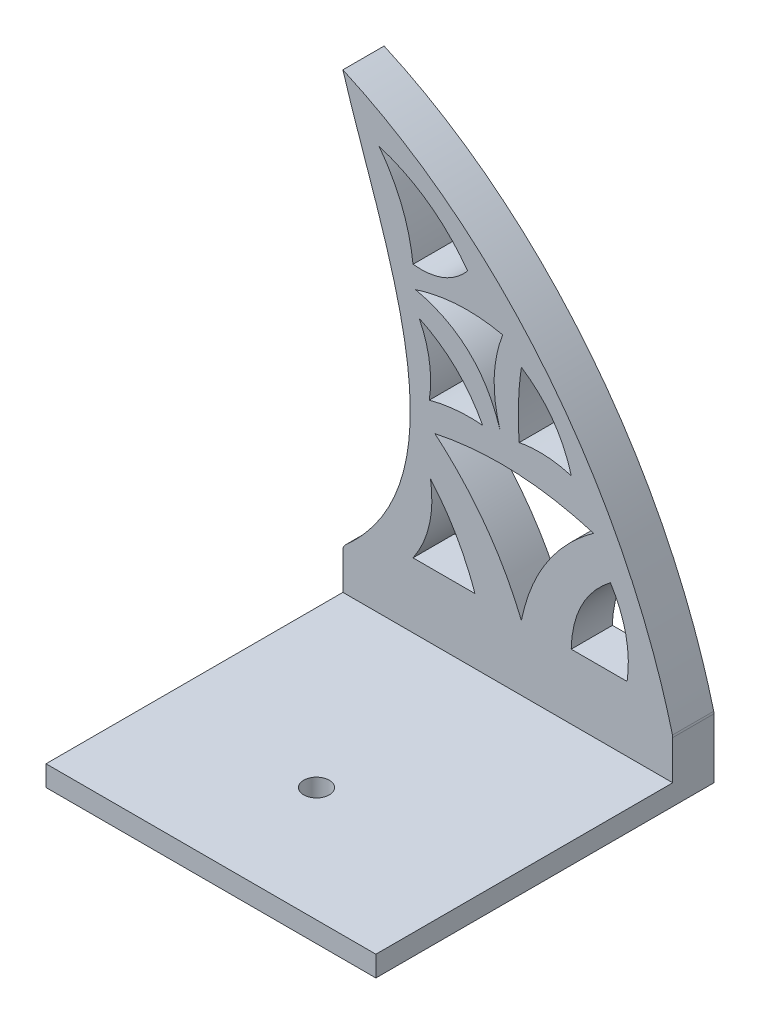
ISO-10303-21;
HEADER;
FILE_DESCRIPTION(('STEP AP214'),'2;1');
FILE_NAME('part.step','',(''),(''),'','','');
FILE_SCHEMA(('AUTOMOTIVE_DESIGN { 1 0 10303 214 1 1 1 1 }'));
ENDSEC;
DATA;
#1=APPLICATION_CONTEXT('core data for automotive mechanical design processes');
#2=APPLICATION_PROTOCOL_DEFINITION('international standard','automotive_design',2000,#1);
#3=PRODUCT_CONTEXT('',#1,'mechanical');
#4=PRODUCT('Part','Part','',(#3));
#5=PRODUCT_RELATED_PRODUCT_CATEGORY('part','',(#4));
#6=PRODUCT_DEFINITION_FORMATION('','',#4);
#7=PRODUCT_DEFINITION_CONTEXT('part definition',#1,'design');
#8=PRODUCT_DEFINITION('design','',#6,#7);
#9=PRODUCT_DEFINITION_SHAPE('','',#8);
#10=(LENGTH_UNIT() NAMED_UNIT(*) SI_UNIT(.MILLI.,.METRE.));
#11=(NAMED_UNIT(*) PLANE_ANGLE_UNIT() SI_UNIT($,.RADIAN.));
#12=(NAMED_UNIT(*) SI_UNIT($,.STERADIAN.) SOLID_ANGLE_UNIT());
#13=UNCERTAINTY_MEASURE_WITH_UNIT(LENGTH_MEASURE(1.E-05),#10,'distance_accuracy_value','');
#14=(GEOMETRIC_REPRESENTATION_CONTEXT(3) GLOBAL_UNCERTAINTY_ASSIGNED_CONTEXT((#13)) GLOBAL_UNIT_ASSIGNED_CONTEXT((#10,
#11,#12)) REPRESENTATION_CONTEXT('',''));
#15=CARTESIAN_POINT('',(0.,0.,0.));
#16=DIRECTION('',(0.,0.,1.));
#17=DIRECTION('',(1.,0.,0.));
#18=AXIS2_PLACEMENT_3D('',#15,#16,#17);
#19=CARTESIAN_POINT('',(0.,0.,12.7));
#20=DIRECTION('',(-1.,0.,0.));
#21=DIRECTION('',(0.,0.,1.));
#22=AXIS2_PLACEMENT_3D('',#19,#20,#21);
#23=PLANE('',#22);
#24=DIRECTION('',(0.,1.,0.));
#25=VECTOR('',#24,1.);
#26=CARTESIAN_POINT('',(0.,0.,0.));
#27=LINE('',#26,#25);
#28=CARTESIAN_POINT('',(0.,133.663922723156,0.));
#29=VERTEX_POINT('',#28);
#30=CARTESIAN_POINT('',(0.,151.251284081008,0.));
#31=VERTEX_POINT('',#30);
#32=EDGE_CURVE('E369',#29,#31,#27,.T.);
#33=ORIENTED_EDGE('',*,*,#32,.F.);
#34=DIRECTION('',(0.,0.,1.));
#35=VECTOR('',#34,1.);
#36=CARTESIAN_POINT('',(0.,133.663922723156,0.));
#37=LINE('',#36,#35);
#38=CARTESIAN_POINT('',(0.,133.663922723156,104.14));
#39=VERTEX_POINT('',#38);
#40=EDGE_CURVE('E73',#29,#39,#37,.T.);
#41=ORIENTED_EDGE('',*,*,#40,.T.);
#42=DIRECTION('',(0.,-1.,0.));
#43=VECTOR('',#42,1.);
#44=CARTESIAN_POINT('',(0.,133.663922723156,104.14));
#45=LINE('',#44,#43);
#46=CARTESIAN_POINT('',(0.,140.013922723156,104.14));
#47=VERTEX_POINT('',#46);
#48=EDGE_CURVE('E257',#47,#39,#45,.T.);
#49=ORIENTED_EDGE('',*,*,#48,.F.);
#50=DIRECTION('',(0.,0.,-1.));
#51=VECTOR('',#50,1.);
#52=CARTESIAN_POINT('',(0.,140.013922723156,104.14));
#53=LINE('',#52,#51);
#54=CARTESIAN_POINT('',(0.,140.013922723156,12.7));
#55=VERTEX_POINT('',#54);
#56=EDGE_CURVE('E252',#47,#55,#53,.T.);
#57=ORIENTED_EDGE('',*,*,#56,.T.);
#58=DIRECTION('',(0.,1.,0.));
#59=VECTOR('',#58,1.);
#60=CARTESIAN_POINT('',(0.,0.,12.7));
#61=LINE('',#60,#59);
#62=CARTESIAN_POINT('',(0.,151.251284081008,12.7));
#63=VERTEX_POINT('',#62);
#64=EDGE_CURVE('E368',#55,#63,#61,.T.);
#65=ORIENTED_EDGE('',*,*,#64,.T.);
#66=DIRECTION('',(0.,0.,-1.));
#67=VECTOR('',#66,1.);
#68=CARTESIAN_POINT('',(0.,151.251284081008,12.7));
#69=LINE('',#68,#67);
#70=EDGE_CURVE('E58',#63,#31,#69,.T.);
#71=ORIENTED_EDGE('',*,*,#70,.T.);
#72=EDGE_LOOP('',(#33,#41,#49,#57,#65,#71));
#73=FACE_BOUND('',#72,.T.);
#74=ADVANCED_FACE('F49',(#73),#23,.T.);
#75=CARTESIAN_POINT('',(101.6,0.,12.7));
#76=DIRECTION('',(-1.,0.,0.));
#77=DIRECTION('',(0.,0.,1.));
#78=AXIS2_PLACEMENT_3D('',#75,#76,#77);
#79=PLANE('',#78);
#80=DIRECTION('',(0.,0.,1.));
#81=VECTOR('',#80,1.);
#82=CARTESIAN_POINT('',(101.6,133.663922723156,0.));
#83=LINE('',#82,#81);
#84=CARTESIAN_POINT('',(101.6,133.663922723156,0.));
#85=VERTEX_POINT('',#84);
#86=CARTESIAN_POINT('',(101.6,133.663922723156,104.14));
#87=VERTEX_POINT('',#86);
#88=EDGE_CURVE('E281',#85,#87,#83,.T.);
#89=ORIENTED_EDGE('',*,*,#88,.F.);
#90=DIRECTION('',(0.,1.,0.));
#91=VECTOR('',#90,1.);
#92=CARTESIAN_POINT('',(101.6,0.,0.));
#93=LINE('',#92,#91);
#94=CARTESIAN_POINT('',(101.6,152.077820816032,0.));
#95=VERTEX_POINT('',#94);
#96=EDGE_CURVE('E372',#85,#95,#93,.T.);
#97=ORIENTED_EDGE('',*,*,#96,.T.);
#98=DIRECTION('',(0.,0.,1.));
#99=VECTOR('',#98,1.);
#100=CARTESIAN_POINT('',(101.6,152.077820816032,12.7));
#101=LINE('',#100,#99);
#102=CARTESIAN_POINT('',(101.6,152.077820816032,12.7));
#103=VERTEX_POINT('',#102);
#104=EDGE_CURVE('E342',#95,#103,#101,.T.);
#105=ORIENTED_EDGE('',*,*,#104,.T.);
#106=DIRECTION('',(0.,1.,0.));
#107=VECTOR('',#106,1.);
#108=CARTESIAN_POINT('',(101.6,0.,12.7));
#109=LINE('',#108,#107);
#110=CARTESIAN_POINT('',(101.6,140.013922723156,12.7));
#111=VERTEX_POINT('',#110);
#112=EDGE_CURVE('E270',#111,#103,#109,.T.);
#113=ORIENTED_EDGE('',*,*,#112,.F.);
#114=DIRECTION('',(0.,0.,-1.));
#115=VECTOR('',#114,1.);
#116=CARTESIAN_POINT('',(101.6,140.013922723156,104.14));
#117=LINE('',#116,#115);
#118=CARTESIAN_POINT('',(101.6,140.013922723156,104.14));
#119=VERTEX_POINT('',#118);
#120=EDGE_CURVE('E250',#119,#111,#117,.T.);
#121=ORIENTED_EDGE('',*,*,#120,.F.);
#122=DIRECTION('',(0.,1.,0.));
#123=VECTOR('',#122,1.);
#124=CARTESIAN_POINT('',(101.6,133.663922723156,104.14));
#125=LINE('',#124,#123);
#126=EDGE_CURVE('E258',#87,#119,#125,.T.);
#127=ORIENTED_EDGE('',*,*,#126,.F.);
#128=EDGE_LOOP('',(#89,#97,#105,#113,#121,#127));
#129=FACE_BOUND('',#128,.T.);
#130=ADVANCED_FACE('F268',(#129),#79,.F.);
#131=CARTESIAN_POINT('',(0.,0.,12.7));
#132=DIRECTION('',(0.,0.,1.));
#133=DIRECTION('',(1.,0.,0.));
#134=AXIS2_PLACEMENT_3D('',#131,#132,#133);
#135=PLANE('',#134);
#136=DIRECTION('',(-1.,0.,0.));
#137=VECTOR('',#136,1.);
#138=CARTESIAN_POINT('',(101.6,140.013922723156,12.7));
#139=LINE('',#138,#137);
#140=EDGE_CURVE('E65',#111,#55,#139,.T.);
#141=ORIENTED_EDGE('',*,*,#140,.F.);
#142=ORIENTED_EDGE('',*,*,#112,.T.);
#143=CARTESIAN_POINT('',(99.06,152.077820816032,12.7));
#144=DIRECTION('',(0.,0.,1.));
#145=DIRECTION('',(1.,0.,0.));
#146=AXIS2_PLACEMENT_3D('',#143,#144,#145);
#147=CIRCLE('',#146,2.54);
#148=CARTESIAN_POINT('',(101.519048921032,152.713964199217,12.7));
#149=VERTEX_POINT('',#148);
#150=EDGE_CURVE('E341',#103,#149,#147,.T.);
#151=ORIENTED_EDGE('',*,*,#150,.T.);
#152=CARTESIAN_POINT('',(0.,279.4,12.7));
#153=CARTESIAN_POINT('',(51.286050257495,256.550041835225,12.7));
#154=CARTESIAN_POINT('',(87.8368923823486,205.957944637487,12.7));
#155=CARTESIAN_POINT('',(101.6,152.4,12.7));
#156=B_SPLINE_CURVE_WITH_KNOTS('',3,(#152,#153,#154,#155),.UNSPECIFIED.,.F.,.F.,(4,4),(0.,1.),.UNSPECIFIED.);
#157=CARTESIAN_POINT('',(0.,279.4,12.7));
#158=VERTEX_POINT('',#157);
#159=EDGE_CURVE('E782',#158,#149,#156,.T.);
#160=ORIENTED_EDGE('',*,*,#159,.F.);
#161=CARTESIAN_POINT('',(0.,152.4,12.7));
#162=CARTESIAN_POINT('',(39.7901112765311,186.839065643264,12.7));
#163=CARTESIAN_POINT('',(12.3097562496038,238.845497072906,12.7));
#164=CARTESIAN_POINT('',(0.,279.4,12.7));
#165=B_SPLINE_CURVE_WITH_KNOTS('',3,(#161,#162,#163,#164),.UNSPECIFIED.,.F.,.F.,(4,4),(0.,1.),.UNSPECIFIED.);
#166=CARTESIAN_POINT('',(0.847696562527861,153.145408964832,12.7));
#167=VERTEX_POINT('',#166);
#168=EDGE_CURVE('E791',#167,#158,#165,.T.);
#169=ORIENTED_EDGE('',*,*,#168,.F.);
#170=CARTESIAN_POINT('',(2.54,151.251284081008,12.7));
#171=DIRECTION('',(0.,0.,1.));
#172=DIRECTION('',(1.,0.,0.));
#173=AXIS2_PLACEMENT_3D('',#170,#171,#172);
#174=CIRCLE('',#173,2.54);
#175=EDGE_CURVE('E348',#167,#63,#174,.T.);
#176=ORIENTED_EDGE('',*,*,#175,.T.);
#177=ORIENTED_EDGE('',*,*,#64,.F.);
#178=EDGE_LOOP('',(#141,#142,#151,#160,#169,#176,#177));
#179=FACE_BOUND('',#178,.T.);
#180=CARTESIAN_POINT('',(49.2258384870738,233.315766273676,12.7));
#181=CARTESIAN_POINT('',(35.6412289440212,236.267866948693,12.7));
#182=CARTESIAN_POINT('',(22.3756152670284,231.937259722309,12.7));
#183=B_SPLINE_CURVE_WITH_KNOTS('',2,(#180,#181,#182),.UNSPECIFIED.,.F.,.F.,(3,3),(0.,1.),.UNSPECIFIED.);
#184=CARTESIAN_POINT('',(49.2258384870738,233.315766273676,12.7));
#185=VERTEX_POINT('',#184);
#186=CARTESIAN_POINT('',(22.3756152670284,231.937259722309,12.7));
#187=VERTEX_POINT('',#186);
#188=EDGE_CURVE('E287',#185,#187,#183,.T.);
#189=ORIENTED_EDGE('',*,*,#188,.F.);
#190=CARTESIAN_POINT('',(48.4003507205885,207.535437600744,12.7));
#191=CARTESIAN_POINT('',(44.3935689433076,220.734513873405,12.7));
#192=CARTESIAN_POINT('',(49.2258384870738,233.315766273676,12.7));
#193=B_SPLINE_CURVE_WITH_KNOTS('',2,(#190,#191,#192),.UNSPECIFIED.,.F.,.F.,(3,3),(0.,1.),.UNSPECIFIED.);
#194=CARTESIAN_POINT('',(48.4003507205885,207.535437600744,12.7));
#195=VERTEX_POINT('',#194);
#196=EDGE_CURVE('E294',#195,#185,#193,.T.);
#197=ORIENTED_EDGE('',*,*,#196,.F.);
#198=CARTESIAN_POINT('',(48.4003507205885,207.535437600744,12.7));
#199=CARTESIAN_POINT('',(42.0541709012612,227.566198030611,12.7));
#200=CARTESIAN_POINT('',(22.3756152670284,231.937259722309,12.7));
#201=B_SPLINE_CURVE_WITH_KNOTS('',2,(#198,#199,#200),.UNSPECIFIED.,.F.,.F.,(3,3),(0.,1.),.UNSPECIFIED.);
#202=EDGE_CURVE('E923',#195,#187,#201,.T.);
#203=ORIENTED_EDGE('',*,*,#202,.T.);
#204=EDGE_LOOP('',(#189,#197,#203));
#205=FACE_BOUND('',#204,.T.);
#206=CARTESIAN_POINT('',(43.0534809797926,206.088034939823,12.7));
#207=CARTESIAN_POINT('',(36.2397899942018,218.912660539888,12.7));
#208=CARTESIAN_POINT('',(23.5160663721444,224.861937296205,12.7));
#209=B_SPLINE_CURVE_WITH_KNOTS('',2,(#206,#207,#208),.UNSPECIFIED.,.F.,.F.,(3,3),(0.,1.),.UNSPECIFIED.);
#210=CARTESIAN_POINT('',(43.0534809797926,206.088034939823,12.7));
#211=VERTEX_POINT('',#210);
#212=CARTESIAN_POINT('',(23.5160663721444,224.861937296205,12.7));
#213=VERTEX_POINT('',#212);
#214=EDGE_CURVE('E854',#211,#213,#209,.T.);
#215=ORIENTED_EDGE('',*,*,#214,.F.);
#216=CARTESIAN_POINT('',(26.6057281170054,204.582177714214,12.7));
#217=CARTESIAN_POINT('',(34.7004326090841,206.792891753804,12.7));
#218=CARTESIAN_POINT('',(43.0534809797926,206.088034939823,12.7));
#219=B_SPLINE_CURVE_WITH_KNOTS('',2,(#216,#217,#218),.UNSPECIFIED.,.F.,.F.,(3,3),(0.,1.),.UNSPECIFIED.);
#220=CARTESIAN_POINT('',(26.6057281170054,204.582177714214,12.7));
#221=VERTEX_POINT('',#220);
#222=EDGE_CURVE('E915',#221,#211,#219,.T.);
#223=ORIENTED_EDGE('',*,*,#222,.F.);
#224=CARTESIAN_POINT('',(23.5160663721444,224.861937296205,12.7));
#225=CARTESIAN_POINT('',(28.2352954071151,215.219272619894,12.7));
#226=CARTESIAN_POINT('',(26.6057281170054,204.582177714214,12.7));
#227=B_SPLINE_CURVE_WITH_KNOTS('',2,(#224,#225,#226),.UNSPECIFIED.,.F.,.F.,(3,3),(0.,1.),.UNSPECIFIED.);
#228=EDGE_CURVE('E910',#213,#221,#227,.T.);
#229=ORIENTED_EDGE('',*,*,#228,.F.);
#230=EDGE_LOOP('',(#215,#223,#229));
#231=FACE_BOUND('',#230,.T.);
#232=CARTESIAN_POINT('',(82.3960896551855,183.8137177803,12.7));
#233=CARTESIAN_POINT('',(70.6713648996861,174.663598783607,12.7));
#234=CARTESIAN_POINT('',(70.3277731701593,160.02,12.7));
#235=B_SPLINE_CURVE_WITH_KNOTS('',2,(#232,#233,#234),.UNSPECIFIED.,.F.,.F.,(3,3),(0.,1.),.UNSPECIFIED.);
#236=CARTESIAN_POINT('',(82.3960896551855,183.8137177803,12.7));
#237=VERTEX_POINT('',#236);
#238=CARTESIAN_POINT('',(70.3277731701593,160.02,12.7));
#239=VERTEX_POINT('',#238);
#240=EDGE_CURVE('E824',#237,#239,#235,.T.);
#241=ORIENTED_EDGE('',*,*,#240,.F.);
#242=CARTESIAN_POINT('',(82.3960896551855,183.8137177803,12.7));
#243=CARTESIAN_POINT('',(89.3395503674179,172.773814042826,12.7));
#244=CARTESIAN_POINT('',(87.546521436446,160.02,12.7));
#245=B_SPLINE_CURVE_WITH_KNOTS('',2,(#242,#243,#244),.UNSPECIFIED.,.F.,.F.,(3,3),(0.,1.),.UNSPECIFIED.);
#246=CARTESIAN_POINT('',(87.546521436446,160.02,12.7));
#247=VERTEX_POINT('',#246);
#248=EDGE_CURVE('E818',#237,#247,#245,.T.);
#249=ORIENTED_EDGE('',*,*,#248,.T.);
#250=DIRECTION('',(1.,0.,0.));
#251=VECTOR('',#250,1.);
#252=CARTESIAN_POINT('',(0.,160.02,12.7));
#253=LINE('',#252,#251);
#254=EDGE_CURVE('E823',#239,#247,#253,.T.);
#255=ORIENTED_EDGE('',*,*,#254,.F.);
#256=EDGE_LOOP('',(#241,#249,#255));
#257=FACE_BOUND('',#256,.T.);
#258=CARTESIAN_POINT('',(26.9804663757679,183.813742110307,12.7));
#259=CARTESIAN_POINT('',(28.9587756049128,170.83754360767,12.7));
#260=CARTESIAN_POINT('',(21.602944742717,160.02,12.7));
#261=B_SPLINE_CURVE_WITH_KNOTS('',2,(#258,#259,#260),.UNSPECIFIED.,.F.,.F.,(3,3),(0.,1.),.UNSPECIFIED.);
#262=CARTESIAN_POINT('',(26.9804663757679,183.813742110307,12.7));
#263=VERTEX_POINT('',#262);
#264=CARTESIAN_POINT('',(21.602944742717,160.02,12.7));
#265=VERTEX_POINT('',#264);
#266=EDGE_CURVE('E772',#263,#265,#261,.T.);
#267=ORIENTED_EDGE('',*,*,#266,.F.);
#268=CARTESIAN_POINT('',(26.9804663757679,183.813742110307,12.7));
#269=CARTESIAN_POINT('',(36.1384728498924,173.175056715144,12.7));
#270=CARTESIAN_POINT('',(40.6766417755855,160.02,12.7));
#271=B_SPLINE_CURVE_WITH_KNOTS('',2,(#268,#269,#270),.UNSPECIFIED.,.F.,.F.,(3,3),(0.,1.),.UNSPECIFIED.);
#272=CARTESIAN_POINT('',(40.6766417755855,160.02,12.7));
#273=VERTEX_POINT('',#272);
#274=EDGE_CURVE('E766',#263,#273,#271,.T.);
#275=ORIENTED_EDGE('',*,*,#274,.T.);
#276=DIRECTION('',(-1.,0.,0.));
#277=VECTOR('',#276,1.);
#278=CARTESIAN_POINT('',(0.,160.02,12.7));
#279=LINE('',#278,#277);
#280=EDGE_CURVE('E746',#273,#265,#279,.T.);
#281=ORIENTED_EDGE('',*,*,#280,.T.);
#282=EDGE_LOOP('',(#267,#275,#281));
#283=FACE_BOUND('',#282,.T.);
#284=CARTESIAN_POINT('',(54.9770830803954,160.02,12.7));
#285=CARTESIAN_POINT('',(46.0834758399413,181.547553160455,12.7));
#286=CARTESIAN_POINT('',(28.3421369029203,196.52980248231,12.7));
#287=B_SPLINE_CURVE_WITH_KNOTS('',2,(#284,#285,#286),.UNSPECIFIED.,.F.,.F.,(3,3),(0.,1.),.UNSPECIFIED.);
#288=CARTESIAN_POINT('',(54.9770830803954,160.02,12.7));
#289=VERTEX_POINT('',#288);
#290=CARTESIAN_POINT('',(28.3421369029203,196.52980248231,12.7));
#291=VERTEX_POINT('',#290);
#292=EDGE_CURVE('E736',#289,#291,#287,.T.);
#293=ORIENTED_EDGE('',*,*,#292,.T.);
#294=CARTESIAN_POINT('',(28.3421369029203,196.52980248231,12.7));
#295=CARTESIAN_POINT('',(53.0178150021792,201.732288520624,12.7));
#296=CARTESIAN_POINT('',(77.1872044953657,194.363538627742,12.7));
#297=B_SPLINE_CURVE_WITH_KNOTS('',2,(#294,#295,#296),.UNSPECIFIED.,.F.,.F.,(3,3),(0.,1.),.UNSPECIFIED.);
#298=CARTESIAN_POINT('',(77.1872044953657,194.363538627742,12.7));
#299=VERTEX_POINT('',#298);
#300=EDGE_CURVE('E727',#291,#299,#297,.T.);
#301=ORIENTED_EDGE('',*,*,#300,.T.);
#302=CARTESIAN_POINT('',(54.9770830803954,160.02,12.7));
#303=CARTESIAN_POINT('',(59.3747288950181,181.400643158016,12.7));
#304=CARTESIAN_POINT('',(77.1872044953657,194.363538627742,12.7));
#305=B_SPLINE_CURVE_WITH_KNOTS('',2,(#302,#303,#304),.UNSPECIFIED.,.F.,.F.,(3,3),(0.,1.),.UNSPECIFIED.);
#306=EDGE_CURVE('E721',#289,#299,#305,.T.);
#307=ORIENTED_EDGE('',*,*,#306,.F.);
#308=EDGE_LOOP('',(#293,#301,#307));
#309=FACE_BOUND('',#308,.T.);
#310=CARTESIAN_POINT('',(70.3282595613759,206.27745757837,12.7));
#311=CARTESIAN_POINT('',(62.3615769619994,208.669014940846,12.7));
#312=CARTESIAN_POINT('',(54.287141361752,207.109917469007,12.7));
#313=B_SPLINE_CURVE_WITH_KNOTS('',2,(#310,#311,#312),.UNSPECIFIED.,.F.,.F.,(3,3),(0.,1.),.UNSPECIFIED.);
#314=CARTESIAN_POINT('',(70.3282595613759,206.27745757837,12.7));
#315=VERTEX_POINT('',#314);
#316=CARTESIAN_POINT('',(54.287141361752,207.109917469007,12.7));
#317=VERTEX_POINT('',#316);
#318=EDGE_CURVE('E697',#315,#317,#313,.T.);
#319=ORIENTED_EDGE('',*,*,#318,.T.);
#320=CARTESIAN_POINT('',(54.287141361752,207.109917469007,12.7));
#321=CARTESIAN_POINT('',(53.4820968113887,217.391663166995,12.7));
#322=CARTESIAN_POINT('',(54.9770830803954,227.557269011986,12.7));
#323=B_SPLINE_CURVE_WITH_KNOTS('',2,(#320,#321,#322),.UNSPECIFIED.,.F.,.F.,(3,3),(0.,1.),.UNSPECIFIED.);
#324=CARTESIAN_POINT('',(54.9770830803954,227.557269011986,12.7));
#325=VERTEX_POINT('',#324);
#326=EDGE_CURVE('E688',#317,#325,#323,.T.);
#327=ORIENTED_EDGE('',*,*,#326,.T.);
#328=CARTESIAN_POINT('',(54.9770830803954,227.557269011986,12.7));
#329=CARTESIAN_POINT('',(66.6458597542174,219.852180833507,12.7));
#330=CARTESIAN_POINT('',(70.3282595613759,206.27745757837,12.7));
#331=B_SPLINE_CURVE_WITH_KNOTS('',2,(#328,#329,#330),.UNSPECIFIED.,.F.,.F.,(3,3),(0.,1.),.UNSPECIFIED.);
#332=EDGE_CURVE('E679',#325,#315,#331,.T.);
#333=ORIENTED_EDGE('',*,*,#332,.T.);
#334=EDGE_LOOP('',(#319,#327,#333));
#335=FACE_BOUND('',#334,.T.);
#336=CARTESIAN_POINT('',(21.602944742717,238.323137826184,12.7));
#337=CARTESIAN_POINT('',(19.9519756703058,252.974545224531,12.7));
#338=CARTESIAN_POINT('',(11.0947377675254,264.601494060694,12.7));
#339=B_SPLINE_CURVE_WITH_KNOTS('',2,(#336,#337,#338),.UNSPECIFIED.,.F.,.F.,(3,3),(0.,1.),.UNSPECIFIED.);
#340=CARTESIAN_POINT('',(21.602944742717,238.323137826184,12.7));
#341=VERTEX_POINT('',#340);
#342=CARTESIAN_POINT('',(11.0947377675254,264.601494060694,12.7));
#343=VERTEX_POINT('',#342);
#344=EDGE_CURVE('E673',#341,#343,#339,.T.);
#345=ORIENTED_EDGE('',*,*,#344,.T.);
#346=CARTESIAN_POINT('',(11.0947377675254,264.601494060694,12.7));
#347=CARTESIAN_POINT('',(28.0538351864922,259.295838114787,12.7));
#348=CARTESIAN_POINT('',(38.4122672823243,244.949944055659,12.7));
#349=B_SPLINE_CURVE_WITH_KNOTS('',2,(#346,#347,#348),.UNSPECIFIED.,.F.,.F.,(3,3),(0.,1.),.UNSPECIFIED.);
#350=CARTESIAN_POINT('',(38.4122672823243,244.949944055659,12.7));
#351=VERTEX_POINT('',#350);
#352=EDGE_CURVE('E651',#343,#351,#349,.T.);
#353=ORIENTED_EDGE('',*,*,#352,.T.);
#354=CARTESIAN_POINT('',(21.602944742717,238.323137826184,12.7));
#355=CARTESIAN_POINT('',(31.864782778685,237.284469605231,12.7));
#356=CARTESIAN_POINT('',(38.4122672823243,244.949944055659,12.7));
#357=B_SPLINE_CURVE_WITH_KNOTS('',2,(#354,#355,#356),.UNSPECIFIED.,.F.,.F.,(3,3),(0.,1.),.UNSPECIFIED.);
#358=EDGE_CURVE('E390',#341,#351,#357,.T.);
#359=ORIENTED_EDGE('',*,*,#358,.F.);
#360=EDGE_LOOP('',(#345,#353,#359));
#361=FACE_BOUND('',#360,.T.);
#362=ADVANCED_FACE('F312',(#179,#205,#231,#257,#283,#309,#335,#361),#135,.T.);
#363=CARTESIAN_POINT('',(0.,0.,0.));
#364=DIRECTION('',(0.,0.,1.));
#365=DIRECTION('',(1.,0.,0.));
#366=AXIS2_PLACEMENT_3D('',#363,#364,#365);
#367=PLANE('',#366);
#368=CARTESIAN_POINT('',(21.602944742717,238.323137826184,0.));
#369=CARTESIAN_POINT('',(19.9519756703058,252.974545224531,0.));
#370=CARTESIAN_POINT('',(11.0947377675254,264.601494060694,0.));
#371=B_SPLINE_CURVE_WITH_KNOTS('',2,(#368,#369,#370),.UNSPECIFIED.,.F.,.F.,(3,3),(0.,1.),.UNSPECIFIED.);
#372=CARTESIAN_POINT('',(21.602944742717,238.323137826184,0.));
#373=VERTEX_POINT('',#372);
#374=CARTESIAN_POINT('',(11.0947377675254,264.601494060694,0.));
#375=VERTEX_POINT('',#374);
#376=EDGE_CURVE('E467',#373,#375,#371,.T.);
#377=ORIENTED_EDGE('',*,*,#376,.F.);
#378=CARTESIAN_POINT('',(21.602944742717,238.323137826184,0.));
#379=CARTESIAN_POINT('',(31.864782778685,237.284469605231,0.));
#380=CARTESIAN_POINT('',(38.4122672823243,244.949944055659,0.));
#381=B_SPLINE_CURVE_WITH_KNOTS('',2,(#378,#379,#380),.UNSPECIFIED.,.F.,.F.,(3,3),(0.,1.),.UNSPECIFIED.);
#382=CARTESIAN_POINT('',(38.4122672823243,244.949944055659,0.));
#383=VERTEX_POINT('',#382);
#384=EDGE_CURVE('E295',#373,#383,#381,.T.);
#385=ORIENTED_EDGE('',*,*,#384,.T.);
#386=CARTESIAN_POINT('',(11.0947377675254,264.601494060694,0.));
#387=CARTESIAN_POINT('',(28.0538351864922,259.295838114787,0.));
#388=CARTESIAN_POINT('',(38.4122672823243,244.949944055659,0.));
#389=B_SPLINE_CURVE_WITH_KNOTS('',2,(#386,#387,#388),.UNSPECIFIED.,.F.,.F.,(3,3),(0.,1.),.UNSPECIFIED.);
#390=EDGE_CURVE('E458',#375,#383,#389,.T.);
#391=ORIENTED_EDGE('',*,*,#390,.F.);
#392=EDGE_LOOP('',(#377,#385,#391));
#393=FACE_BOUND('',#392,.T.);
#394=CARTESIAN_POINT('',(70.3282595613759,206.27745757837,0.));
#395=CARTESIAN_POINT('',(62.3615769619994,208.669014940846,0.));
#396=CARTESIAN_POINT('',(54.287141361752,207.109917469007,0.));
#397=B_SPLINE_CURVE_WITH_KNOTS('',2,(#394,#395,#396),.UNSPECIFIED.,.F.,.F.,(3,3),(0.,1.),.UNSPECIFIED.);
#398=CARTESIAN_POINT('',(70.3282595613759,206.27745757837,0.));
#399=VERTEX_POINT('',#398);
#400=CARTESIAN_POINT('',(54.287141361752,207.109917469007,0.));
#401=VERTEX_POINT('',#400);
#402=EDGE_CURVE('E492',#399,#401,#397,.T.);
#403=ORIENTED_EDGE('',*,*,#402,.F.);
#404=CARTESIAN_POINT('',(54.9770830803954,227.557269011986,0.));
#405=CARTESIAN_POINT('',(66.6458597542174,219.852180833507,0.));
#406=CARTESIAN_POINT('',(70.3282595613759,206.27745757837,0.));
#407=B_SPLINE_CURVE_WITH_KNOTS('',2,(#404,#405,#406),.UNSPECIFIED.,.F.,.F.,(3,3),(0.,1.),.UNSPECIFIED.);
#408=CARTESIAN_POINT('',(54.9770830803954,227.557269011986,0.));
#409=VERTEX_POINT('',#408);
#410=EDGE_CURVE('E476',#409,#399,#407,.T.);
#411=ORIENTED_EDGE('',*,*,#410,.F.);
#412=CARTESIAN_POINT('',(54.287141361752,207.109917469007,0.));
#413=CARTESIAN_POINT('',(53.4820968113887,217.391663166995,0.));
#414=CARTESIAN_POINT('',(54.9770830803954,227.557269011986,0.));
#415=B_SPLINE_CURVE_WITH_KNOTS('',2,(#412,#413,#414),.UNSPECIFIED.,.F.,.F.,(3,3),(0.,1.),.UNSPECIFIED.);
#416=EDGE_CURVE('E484',#401,#409,#415,.T.);
#417=ORIENTED_EDGE('',*,*,#416,.F.);
#418=EDGE_LOOP('',(#403,#411,#417));
#419=FACE_BOUND('',#418,.T.);
#420=CARTESIAN_POINT('',(54.9770830803954,160.02,0.));
#421=CARTESIAN_POINT('',(46.0834758399413,181.547553160455,0.));
#422=CARTESIAN_POINT('',(28.3421369029203,196.52980248231,0.));
#423=B_SPLINE_CURVE_WITH_KNOTS('',2,(#420,#421,#422),.UNSPECIFIED.,.F.,.F.,(3,3),(0.,1.),.UNSPECIFIED.);
#424=CARTESIAN_POINT('',(54.9770830803954,160.02,0.));
#425=VERTEX_POINT('',#424);
#426=CARTESIAN_POINT('',(28.3421369029203,196.52980248231,0.));
#427=VERTEX_POINT('',#426);
#428=EDGE_CURVE('E519',#425,#427,#423,.T.);
#429=ORIENTED_EDGE('',*,*,#428,.F.);
#430=CARTESIAN_POINT('',(54.9770830803954,160.02,0.));
#431=CARTESIAN_POINT('',(59.3747288950181,181.400643158016,0.));
#432=CARTESIAN_POINT('',(77.1872044953657,194.363538627742,0.));
#433=B_SPLINE_CURVE_WITH_KNOTS('',2,(#430,#431,#432),.UNSPECIFIED.,.F.,.F.,(3,3),(0.,1.),.UNSPECIFIED.);
#434=CARTESIAN_POINT('',(77.1872044953657,194.363538627742,0.));
#435=VERTEX_POINT('',#434);
#436=EDGE_CURVE('E501',#425,#435,#433,.T.);
#437=ORIENTED_EDGE('',*,*,#436,.T.);
#438=CARTESIAN_POINT('',(28.3421369029203,196.52980248231,0.));
#439=CARTESIAN_POINT('',(53.0178150021792,201.732288520624,0.));
#440=CARTESIAN_POINT('',(77.1872044953657,194.363538627742,0.));
#441=B_SPLINE_CURVE_WITH_KNOTS('',2,(#438,#439,#440),.UNSPECIFIED.,.F.,.F.,(3,3),(0.,1.),.UNSPECIFIED.);
#442=EDGE_CURVE('E510',#427,#435,#441,.T.);
#443=ORIENTED_EDGE('',*,*,#442,.F.);
#444=EDGE_LOOP('',(#429,#437,#443));
#445=FACE_BOUND('',#444,.T.);
#446=CARTESIAN_POINT('',(26.9804663757679,183.813742110307,0.));
#447=CARTESIAN_POINT('',(28.9587756049128,170.83754360767,0.));
#448=CARTESIAN_POINT('',(21.602944742717,160.02,0.));
#449=B_SPLINE_CURVE_WITH_KNOTS('',2,(#446,#447,#448),.UNSPECIFIED.,.F.,.F.,(3,3),(0.,1.),.UNSPECIFIED.);
#450=CARTESIAN_POINT('',(26.9804663757679,183.813742110307,0.));
#451=VERTEX_POINT('',#450);
#452=CARTESIAN_POINT('',(21.602944742717,160.02,0.));
#453=VERTEX_POINT('',#452);
#454=EDGE_CURVE('E541',#451,#453,#449,.T.);
#455=ORIENTED_EDGE('',*,*,#454,.T.);
#456=DIRECTION('',(-1.,0.,0.));
#457=VECTOR('',#456,1.);
#458=CARTESIAN_POINT('',(0.,160.02,0.));
#459=LINE('',#458,#457);
#460=CARTESIAN_POINT('',(40.6766417755855,160.02,0.));
#461=VERTEX_POINT('',#460);
#462=EDGE_CURVE('E528',#461,#453,#459,.T.);
#463=ORIENTED_EDGE('',*,*,#462,.F.);
#464=CARTESIAN_POINT('',(26.9804663757679,183.813742110307,0.));
#465=CARTESIAN_POINT('',(36.1384728498924,173.175056715144,0.));
#466=CARTESIAN_POINT('',(40.6766417755855,160.02,0.));
#467=B_SPLINE_CURVE_WITH_KNOTS('',2,(#464,#465,#466),.UNSPECIFIED.,.F.,.F.,(3,3),(0.,1.),.UNSPECIFIED.);
#468=EDGE_CURVE('E535',#451,#461,#467,.T.);
#469=ORIENTED_EDGE('',*,*,#468,.F.);
#470=EDGE_LOOP('',(#455,#463,#469));
#471=FACE_BOUND('',#470,.T.);
#472=CARTESIAN_POINT('',(82.3960896551855,183.8137177803,0.));
#473=CARTESIAN_POINT('',(70.6713648996861,174.663598783607,0.));
#474=CARTESIAN_POINT('',(70.3277731701593,160.02,0.));
#475=B_SPLINE_CURVE_WITH_KNOTS('',2,(#472,#473,#474),.UNSPECIFIED.,.F.,.F.,(3,3),(0.,1.),.UNSPECIFIED.);
#476=CARTESIAN_POINT('',(82.3960896551855,183.8137177803,0.));
#477=VERTEX_POINT('',#476);
#478=CARTESIAN_POINT('',(70.3277731701593,160.02,0.));
#479=VERTEX_POINT('',#478);
#480=EDGE_CURVE('E580',#477,#479,#475,.T.);
#481=ORIENTED_EDGE('',*,*,#480,.T.);
#482=DIRECTION('',(1.,0.,0.));
#483=VECTOR('',#482,1.);
#484=CARTESIAN_POINT('',(0.,160.02,0.));
#485=LINE('',#484,#483);
#486=CARTESIAN_POINT('',(87.546521436446,160.02,0.));
#487=VERTEX_POINT('',#486);
#488=EDGE_CURVE('E567',#479,#487,#485,.T.);
#489=ORIENTED_EDGE('',*,*,#488,.T.);
#490=CARTESIAN_POINT('',(82.3960896551855,183.8137177803,0.));
#491=CARTESIAN_POINT('',(89.3395503674179,172.773814042826,0.));
#492=CARTESIAN_POINT('',(87.546521436446,160.02,0.));
#493=B_SPLINE_CURVE_WITH_KNOTS('',2,(#490,#491,#492),.UNSPECIFIED.,.F.,.F.,(3,3),(0.,1.),.UNSPECIFIED.);
#494=EDGE_CURVE('E574',#477,#487,#493,.T.);
#495=ORIENTED_EDGE('',*,*,#494,.F.);
#496=EDGE_LOOP('',(#481,#489,#495));
#497=FACE_BOUND('',#496,.T.);
#498=CARTESIAN_POINT('',(43.0534809797926,206.088034939823,0.));
#499=CARTESIAN_POINT('',(36.2397899942018,218.912660539888,0.));
#500=CARTESIAN_POINT('',(23.5160663721444,224.861937296205,0.));
#501=B_SPLINE_CURVE_WITH_KNOTS('',2,(#498,#499,#500),.UNSPECIFIED.,.F.,.F.,(3,3),(0.,1.),.UNSPECIFIED.);
#502=CARTESIAN_POINT('',(43.0534809797926,206.088034939823,0.));
#503=VERTEX_POINT('',#502);
#504=CARTESIAN_POINT('',(23.5160663721444,224.861937296205,0.));
#505=VERTEX_POINT('',#504);
#506=EDGE_CURVE('E607',#503,#505,#501,.T.);
#507=ORIENTED_EDGE('',*,*,#506,.T.);
#508=CARTESIAN_POINT('',(23.5160663721444,224.861937296205,0.));
#509=CARTESIAN_POINT('',(28.2352954071151,215.219272619894,0.));
#510=CARTESIAN_POINT('',(26.6057281170054,204.582177714214,0.));
#511=B_SPLINE_CURVE_WITH_KNOTS('',2,(#508,#509,#510),.UNSPECIFIED.,.F.,.F.,(3,3),(0.,1.),.UNSPECIFIED.);
#512=CARTESIAN_POINT('',(26.6057281170054,204.582177714214,0.));
#513=VERTEX_POINT('',#512);
#514=EDGE_CURVE('E589',#505,#513,#511,.T.);
#515=ORIENTED_EDGE('',*,*,#514,.T.);
#516=CARTESIAN_POINT('',(26.6057281170054,204.582177714214,0.));
#517=CARTESIAN_POINT('',(34.7004326090841,206.792891753804,0.));
#518=CARTESIAN_POINT('',(43.0534809797926,206.088034939823,0.));
#519=B_SPLINE_CURVE_WITH_KNOTS('',2,(#516,#517,#518),.UNSPECIFIED.,.F.,.F.,(3,3),(0.,1.),.UNSPECIFIED.);
#520=EDGE_CURVE('E598',#513,#503,#519,.T.);
#521=ORIENTED_EDGE('',*,*,#520,.T.);
#522=EDGE_LOOP('',(#507,#515,#521));
#523=FACE_BOUND('',#522,.T.);
#524=CARTESIAN_POINT('',(49.2258384870738,233.315766273676,0.));
#525=CARTESIAN_POINT('',(35.6412289440212,236.267866948693,0.));
#526=CARTESIAN_POINT('',(22.3756152670284,231.937259722309,0.));
#527=B_SPLINE_CURVE_WITH_KNOTS('',2,(#524,#525,#526),.UNSPECIFIED.,.F.,.F.,(3,3),(0.,1.),.UNSPECIFIED.);
#528=CARTESIAN_POINT('',(49.2258384870738,233.315766273676,0.));
#529=VERTEX_POINT('',#528);
#530=CARTESIAN_POINT('',(22.3756152670284,231.937259722309,0.));
#531=VERTEX_POINT('',#530);
#532=EDGE_CURVE('E284',#529,#531,#527,.T.);
#533=ORIENTED_EDGE('',*,*,#532,.T.);
#534=CARTESIAN_POINT('',(48.4003507205885,207.535437600744,0.));
#535=CARTESIAN_POINT('',(42.0541709012612,227.566198030611,0.));
#536=CARTESIAN_POINT('',(22.3756152670284,231.937259722309,0.));
#537=B_SPLINE_CURVE_WITH_KNOTS('',2,(#534,#535,#536),.UNSPECIFIED.,.F.,.F.,(3,3),(0.,1.),.UNSPECIFIED.);
#538=CARTESIAN_POINT('',(48.4003507205885,207.535437600744,0.));
#539=VERTEX_POINT('',#538);
#540=EDGE_CURVE('E616',#539,#531,#537,.T.);
#541=ORIENTED_EDGE('',*,*,#540,.F.);
#542=CARTESIAN_POINT('',(48.4003507205885,207.535437600744,0.));
#543=CARTESIAN_POINT('',(44.3935689433076,220.734513873405,0.));
#544=CARTESIAN_POINT('',(49.2258384870738,233.315766273676,0.));
#545=B_SPLINE_CURVE_WITH_KNOTS('',2,(#542,#543,#544),.UNSPECIFIED.,.F.,.F.,(3,3),(0.,1.),.UNSPECIFIED.);
#546=EDGE_CURVE('E625',#539,#529,#545,.T.);
#547=ORIENTED_EDGE('',*,*,#546,.T.);
#548=EDGE_LOOP('',(#533,#541,#547));
#549=FACE_BOUND('',#548,.T.);
#550=DIRECTION('',(1.,0.,0.));
#551=VECTOR('',#550,1.);
#552=CARTESIAN_POINT('',(0.,133.663922723156,0.));
#553=LINE('',#552,#551);
#554=EDGE_CURVE('E272',#29,#85,#553,.T.);
#555=ORIENTED_EDGE('',*,*,#554,.F.);
#556=ORIENTED_EDGE('',*,*,#32,.T.);
#557=CARTESIAN_POINT('',(2.54,151.251284081008,0.));
#558=DIRECTION('',(0.,0.,1.));
#559=DIRECTION('',(1.,0.,0.));
#560=AXIS2_PLACEMENT_3D('',#557,#558,#559);
#561=CIRCLE('',#560,2.54);
#562=CARTESIAN_POINT('',(0.847696562527882,153.145408964832,0.));
#563=VERTEX_POINT('',#562);
#564=EDGE_CURVE('E363',#31,#563,#561,.F.);
#565=ORIENTED_EDGE('',*,*,#564,.T.);
#566=CARTESIAN_POINT('',(0.,152.4,0.));
#567=CARTESIAN_POINT('',(39.7901112765311,186.839065643264,0.));
#568=CARTESIAN_POINT('',(12.3097562496038,238.845497072906,0.));
#569=CARTESIAN_POINT('',(0.,279.4,0.));
#570=B_SPLINE_CURVE_WITH_KNOTS('',3,(#566,#567,#568,#569),.UNSPECIFIED.,.F.,.F.,(4,4),(0.,1.),.UNSPECIFIED.);
#571=CARTESIAN_POINT('',(0.,279.4,0.));
#572=VERTEX_POINT('',#571);
#573=EDGE_CURVE('E559',#563,#572,#570,.T.);
#574=ORIENTED_EDGE('',*,*,#573,.T.);
#575=CARTESIAN_POINT('',(0.,279.4,0.));
#576=CARTESIAN_POINT('',(51.286050257495,256.550041835225,0.));
#577=CARTESIAN_POINT('',(87.8368923823486,205.957944637487,0.));
#578=CARTESIAN_POINT('',(101.6,152.4,0.));
#579=B_SPLINE_CURVE_WITH_KNOTS('',3,(#575,#576,#577,#578),.UNSPECIFIED.,.F.,.F.,(4,4),(0.,1.),.UNSPECIFIED.);
#580=CARTESIAN_POINT('',(101.519048921032,152.713964199217,0.));
#581=VERTEX_POINT('',#580);
#582=EDGE_CURVE('E550',#572,#581,#579,.T.);
#583=ORIENTED_EDGE('',*,*,#582,.T.);
#584=CARTESIAN_POINT('',(99.06,152.077820816032,0.));
#585=DIRECTION('',(0.,0.,1.));
#586=DIRECTION('',(1.,0.,0.));
#587=AXIS2_PLACEMENT_3D('',#584,#585,#586);
#588=CIRCLE('',#587,2.54);
#589=EDGE_CURVE('E359',#581,#95,#588,.F.);
#590=ORIENTED_EDGE('',*,*,#589,.T.);
#591=ORIENTED_EDGE('',*,*,#96,.F.);
#592=EDGE_LOOP('',(#555,#556,#565,#574,#583,#590,#591));
#593=FACE_BOUND('',#592,.T.);
#594=ADVANCED_FACE('F315',(#393,#419,#445,#471,#497,#523,#549,#593),#367,.F.);
#595=DIRECTION('',(0.,0.,-1.));
#596=VECTOR('',#595,1.);
#597=SURFACE_OF_LINEAR_EXTRUSION('',#339,#596);
#598=ORIENTED_EDGE('',*,*,#376,.T.);
#599=DIRECTION('',(0.,0.,-1.));
#600=VECTOR('',#599,1.);
#601=CARTESIAN_POINT('',(11.0947377675254,264.601494060694,12.7));
#602=LINE('',#601,#600);
#603=EDGE_CURVE('E375',#343,#375,#602,.T.);
#604=ORIENTED_EDGE('',*,*,#603,.F.);
#605=ORIENTED_EDGE('',*,*,#344,.F.);
#606=DIRECTION('',(0.,0.,-1.));
#607=VECTOR('',#606,1.);
#608=CARTESIAN_POINT('',(21.602944742717,238.323137826184,12.7));
#609=LINE('',#608,#607);
#610=EDGE_CURVE('E437',#341,#373,#609,.T.);
#611=ORIENTED_EDGE('',*,*,#610,.T.);
#612=EDGE_LOOP('',(#598,#604,#605,#611));
#613=FACE_BOUND('',#612,.T.);
#614=ADVANCED_FACE('F318',(#613),#597,.F.);
#615=DIRECTION('',(0.,0.,-1.));
#616=VECTOR('',#615,1.);
#617=SURFACE_OF_LINEAR_EXTRUSION('',#349,#616);
#618=ORIENTED_EDGE('',*,*,#390,.T.);
#619=DIRECTION('',(0.,0.,-1.));
#620=VECTOR('',#619,1.);
#621=CARTESIAN_POINT('',(38.4122672823243,244.949944055659,12.7));
#622=LINE('',#621,#620);
#623=EDGE_CURVE('E448',#351,#383,#622,.T.);
#624=ORIENTED_EDGE('',*,*,#623,.F.);
#625=ORIENTED_EDGE('',*,*,#352,.F.);
#626=ORIENTED_EDGE('',*,*,#603,.T.);
#627=EDGE_LOOP('',(#618,#624,#625,#626));
#628=FACE_BOUND('',#627,.T.);
#629=ADVANCED_FACE('F662',(#628),#617,.F.);
#630=DIRECTION('',(0.,0.,-1.));
#631=VECTOR('',#630,1.);
#632=SURFACE_OF_LINEAR_EXTRUSION('',#313,#631);
#633=ORIENTED_EDGE('',*,*,#402,.T.);
#634=DIRECTION('',(0.,0.,-1.));
#635=VECTOR('',#634,1.);
#636=CARTESIAN_POINT('',(54.287141361752,207.109917469007,12.7));
#637=LINE('',#636,#635);
#638=EDGE_CURVE('E433',#317,#401,#637,.T.);
#639=ORIENTED_EDGE('',*,*,#638,.F.);
#640=ORIENTED_EDGE('',*,*,#318,.F.);
#641=DIRECTION('',(0.,0.,-1.));
#642=VECTOR('',#641,1.);
#643=CARTESIAN_POINT('',(70.3282595613759,206.27745757837,12.7));
#644=LINE('',#643,#642);
#645=EDGE_CURVE('E427',#315,#399,#644,.T.);
#646=ORIENTED_EDGE('',*,*,#645,.T.);
#647=EDGE_LOOP('',(#633,#639,#640,#646));
#648=FACE_BOUND('',#647,.T.);
#649=ADVANCED_FACE('F665',(#648),#632,.F.);
#650=DIRECTION('',(0.,0.,-1.));
#651=VECTOR('',#650,1.);
#652=SURFACE_OF_LINEAR_EXTRUSION('',#323,#651);
#653=ORIENTED_EDGE('',*,*,#416,.T.);
#654=DIRECTION('',(0.,0.,-1.));
#655=VECTOR('',#654,1.);
#656=CARTESIAN_POINT('',(54.9770830803954,227.557269011986,12.7));
#657=LINE('',#656,#655);
#658=EDGE_CURVE('E438',#325,#409,#657,.T.);
#659=ORIENTED_EDGE('',*,*,#658,.F.);
#660=ORIENTED_EDGE('',*,*,#326,.F.);
#661=ORIENTED_EDGE('',*,*,#638,.T.);
#662=EDGE_LOOP('',(#653,#659,#660,#661));
#663=FACE_BOUND('',#662,.T.);
#664=ADVANCED_FACE('F705',(#663),#652,.F.);
#665=DIRECTION('',(0.,0.,-1.));
#666=VECTOR('',#665,1.);
#667=SURFACE_OF_LINEAR_EXTRUSION('',#287,#666);
#668=ORIENTED_EDGE('',*,*,#428,.T.);
#669=DIRECTION('',(0.,0.,-1.));
#670=VECTOR('',#669,1.);
#671=CARTESIAN_POINT('',(28.3421369029203,196.52980248231,12.7));
#672=LINE('',#671,#670);
#673=EDGE_CURVE('E423',#291,#427,#672,.T.);
#674=ORIENTED_EDGE('',*,*,#673,.F.);
#675=ORIENTED_EDGE('',*,*,#292,.F.);
#676=DIRECTION('',(0.,0.,-1.));
#677=VECTOR('',#676,1.);
#678=CARTESIAN_POINT('',(54.9770830803954,160.02,12.7));
#679=LINE('',#678,#677);
#680=EDGE_CURVE('E416',#289,#425,#679,.T.);
#681=ORIENTED_EDGE('',*,*,#680,.T.);
#682=EDGE_LOOP('',(#668,#674,#675,#681));
#683=FACE_BOUND('',#682,.T.);
#684=ADVANCED_FACE('F708',(#683),#667,.F.);
#685=DIRECTION('',(0.,0.,-1.));
#686=VECTOR('',#685,1.);
#687=SURFACE_OF_LINEAR_EXTRUSION('',#297,#686);
#688=ORIENTED_EDGE('',*,*,#442,.T.);
#689=DIRECTION('',(0.,0.,-1.));
#690=VECTOR('',#689,1.);
#691=CARTESIAN_POINT('',(77.1872044953657,194.363538627742,12.7));
#692=LINE('',#691,#690);
#693=EDGE_CURVE('E428',#299,#435,#692,.T.);
#694=ORIENTED_EDGE('',*,*,#693,.F.);
#695=ORIENTED_EDGE('',*,*,#300,.F.);
#696=ORIENTED_EDGE('',*,*,#673,.T.);
#697=EDGE_LOOP('',(#688,#694,#695,#696));
#698=FACE_BOUND('',#697,.T.);
#699=ADVANCED_FACE('F718',(#698),#687,.F.);
#700=DIRECTION('',(0.,0.,-1.));
#701=VECTOR('',#700,1.);
#702=SURFACE_OF_LINEAR_EXTRUSION('',#261,#701);
#703=ORIENTED_EDGE('',*,*,#454,.F.);
#704=DIRECTION('',(0.,0.,-1.));
#705=VECTOR('',#704,1.);
#706=CARTESIAN_POINT('',(26.9804663757679,183.813742110307,12.7));
#707=LINE('',#706,#705);
#708=EDGE_CURVE('E413',#263,#451,#707,.T.);
#709=ORIENTED_EDGE('',*,*,#708,.F.);
#710=ORIENTED_EDGE('',*,*,#266,.T.);
#711=DIRECTION('',(0.,0.,-1.));
#712=VECTOR('',#711,1.);
#713=CARTESIAN_POINT('',(21.602944742717,160.02,12.7));
#714=LINE('',#713,#712);
#715=EDGE_CURVE('E412',#265,#453,#714,.T.);
#716=ORIENTED_EDGE('',*,*,#715,.T.);
#717=EDGE_LOOP('',(#703,#709,#710,#716));
#718=FACE_BOUND('',#717,.T.);
#719=ADVANCED_FACE('F762',(#718),#702,.T.);
#720=DIRECTION('',(0.,0.,-1.));
#721=VECTOR('',#720,1.);
#722=SURFACE_OF_LINEAR_EXTRUSION('',#271,#721);
#723=ORIENTED_EDGE('',*,*,#468,.T.);
#724=DIRECTION('',(0.,0.,-1.));
#725=VECTOR('',#724,1.);
#726=CARTESIAN_POINT('',(40.6766417755855,160.02,12.7));
#727=LINE('',#726,#725);
#728=EDGE_CURVE('E417',#273,#461,#727,.T.);
#729=ORIENTED_EDGE('',*,*,#728,.F.);
#730=ORIENTED_EDGE('',*,*,#274,.F.);
#731=ORIENTED_EDGE('',*,*,#708,.T.);
#732=EDGE_LOOP('',(#723,#729,#730,#731));
#733=FACE_BOUND('',#732,.T.);
#734=ADVANCED_FACE('F758',(#733),#722,.F.);
#735=DIRECTION('',(0.,0.,-1.));
#736=VECTOR('',#735,1.);
#737=SURFACE_OF_LINEAR_EXTRUSION('',#165,#736);
#738=ORIENTED_EDGE('',*,*,#573,.F.);
#739=DIRECTION('',(0.,0.,-1.));
#740=VECTOR('',#739,1.);
#741=CARTESIAN_POINT('',(0.847696562528074,153.145408964832,0.));
#742=LINE('',#741,#740);
#743=EDGE_CURVE('E11',#563,#167,#742,.F.);
#744=ORIENTED_EDGE('',*,*,#743,.T.);
#745=ORIENTED_EDGE('',*,*,#168,.T.);
#746=DIRECTION('',(0.,0.,-1.));
#747=VECTOR('',#746,1.);
#748=CARTESIAN_POINT('',(0.,279.4,12.7));
#749=LINE('',#748,#747);
#750=EDGE_CURVE('E403',#158,#572,#749,.T.);
#751=ORIENTED_EDGE('',*,*,#750,.T.);
#752=EDGE_LOOP('',(#738,#744,#745,#751));
#753=FACE_BOUND('',#752,.T.);
#754=ADVANCED_FACE('F761',(#753),#737,.T.);
#755=DIRECTION('',(0.,0.,-1.));
#756=VECTOR('',#755,1.);
#757=SURFACE_OF_LINEAR_EXTRUSION('',#235,#756);
#758=ORIENTED_EDGE('',*,*,#480,.F.);
#759=DIRECTION('',(0.,0.,-1.));
#760=VECTOR('',#759,1.);
#761=CARTESIAN_POINT('',(82.3960896551855,183.8137177803,12.7));
#762=LINE('',#761,#760);
#763=EDGE_CURVE('E400',#237,#477,#762,.T.);
#764=ORIENTED_EDGE('',*,*,#763,.F.);
#765=ORIENTED_EDGE('',*,*,#240,.T.);
#766=DIRECTION('',(0.,0.,-1.));
#767=VECTOR('',#766,1.);
#768=CARTESIAN_POINT('',(70.3277731701593,160.02,12.7));
#769=LINE('',#768,#767);
#770=EDGE_CURVE('E394',#239,#479,#769,.T.);
#771=ORIENTED_EDGE('',*,*,#770,.T.);
#772=EDGE_LOOP('',(#758,#764,#765,#771));
#773=FACE_BOUND('',#772,.T.);
#774=ADVANCED_FACE('F804',(#773),#757,.T.);
#775=DIRECTION('',(0.,0.,-1.));
#776=VECTOR('',#775,1.);
#777=SURFACE_OF_LINEAR_EXTRUSION('',#245,#776);
#778=ORIENTED_EDGE('',*,*,#494,.T.);
#779=DIRECTION('',(0.,0.,-1.));
#780=VECTOR('',#779,1.);
#781=CARTESIAN_POINT('',(87.546521436446,160.02,12.7));
#782=LINE('',#781,#780);
#783=EDGE_CURVE('E404',#247,#487,#782,.T.);
#784=ORIENTED_EDGE('',*,*,#783,.F.);
#785=ORIENTED_EDGE('',*,*,#248,.F.);
#786=ORIENTED_EDGE('',*,*,#763,.T.);
#787=EDGE_LOOP('',(#778,#784,#785,#786));
#788=FACE_BOUND('',#787,.T.);
#789=ADVANCED_FACE('F810',(#788),#777,.F.);
#790=DIRECTION('',(0.,0.,-1.));
#791=VECTOR('',#790,1.);
#792=SURFACE_OF_LINEAR_EXTRUSION('',#209,#791);
#793=ORIENTED_EDGE('',*,*,#506,.F.);
#794=DIRECTION('',(0.,0.,-1.));
#795=VECTOR('',#794,1.);
#796=CARTESIAN_POINT('',(43.0534809797926,206.088034939823,12.7));
#797=LINE('',#796,#795);
#798=EDGE_CURVE('E391',#211,#503,#797,.T.);
#799=ORIENTED_EDGE('',*,*,#798,.F.);
#800=ORIENTED_EDGE('',*,*,#214,.T.);
#801=DIRECTION('',(0.,0.,-1.));
#802=VECTOR('',#801,1.);
#803=CARTESIAN_POINT('',(23.5160663721444,224.861937296205,12.7));
#804=LINE('',#803,#802);
#805=EDGE_CURVE('E383',#213,#505,#804,.T.);
#806=ORIENTED_EDGE('',*,*,#805,.T.);
#807=EDGE_LOOP('',(#793,#799,#800,#806));
#808=FACE_BOUND('',#807,.T.);
#809=ADVANCED_FACE('F814',(#808),#792,.T.);
#810=DIRECTION('',(0.,0.,-1.));
#811=VECTOR('',#810,1.);
#812=SURFACE_OF_LINEAR_EXTRUSION('',#219,#811);
#813=ORIENTED_EDGE('',*,*,#520,.F.);
#814=DIRECTION('',(0.,0.,-1.));
#815=VECTOR('',#814,1.);
#816=CARTESIAN_POINT('',(26.6057281170054,204.582177714214,12.7));
#817=LINE('',#816,#815);
#818=EDGE_CURVE('E395',#221,#513,#817,.T.);
#819=ORIENTED_EDGE('',*,*,#818,.F.);
#820=ORIENTED_EDGE('',*,*,#222,.T.);
#821=ORIENTED_EDGE('',*,*,#798,.T.);
#822=EDGE_LOOP('',(#813,#819,#820,#821));
#823=FACE_BOUND('',#822,.T.);
#824=ADVANCED_FACE('F309',(#823),#812,.T.);
#825=DIRECTION('',(0.,0.,-1.));
#826=VECTOR('',#825,1.);
#827=SURFACE_OF_LINEAR_EXTRUSION('',#183,#826);
#828=ORIENTED_EDGE('',*,*,#532,.F.);
#829=DIRECTION('',(0.,0.,-1.));
#830=VECTOR('',#829,1.);
#831=CARTESIAN_POINT('',(49.2258384870738,233.315766273676,12.7));
#832=LINE('',#831,#830);
#833=EDGE_CURVE('E380',#185,#529,#832,.T.);
#834=ORIENTED_EDGE('',*,*,#833,.F.);
#835=ORIENTED_EDGE('',*,*,#188,.T.);
#836=DIRECTION('',(0.,0.,-1.));
#837=VECTOR('',#836,1.);
#838=CARTESIAN_POINT('',(22.3756152670284,231.937259722309,12.7));
#839=LINE('',#838,#837);
#840=EDGE_CURVE('E387',#187,#531,#839,.T.);
#841=ORIENTED_EDGE('',*,*,#840,.T.);
#842=EDGE_LOOP('',(#828,#834,#835,#841));
#843=FACE_BOUND('',#842,.T.);
#844=ADVANCED_FACE('F304',(#843),#827,.T.);
#845=DIRECTION('',(0.,0.,-1.));
#846=VECTOR('',#845,1.);
#847=SURFACE_OF_LINEAR_EXTRUSION('',#193,#846);
#848=ORIENTED_EDGE('',*,*,#546,.F.);
#849=DIRECTION('',(0.,0.,-1.));
#850=VECTOR('',#849,1.);
#851=CARTESIAN_POINT('',(48.4003507205885,207.535437600744,12.7));
#852=LINE('',#851,#850);
#853=EDGE_CURVE('E384',#195,#539,#852,.T.);
#854=ORIENTED_EDGE('',*,*,#853,.F.);
#855=ORIENTED_EDGE('',*,*,#196,.T.);
#856=ORIENTED_EDGE('',*,*,#833,.T.);
#857=EDGE_LOOP('',(#848,#854,#855,#856));
#858=FACE_BOUND('',#857,.T.);
#859=ADVANCED_FACE('F308',(#858),#847,.T.);
#860=DIRECTION('',(0.,0.,-1.));
#861=VECTOR('',#860,1.);
#862=SURFACE_OF_LINEAR_EXTRUSION('',#331,#861);
#863=ORIENTED_EDGE('',*,*,#410,.T.);
#864=ORIENTED_EDGE('',*,*,#645,.F.);
#865=ORIENTED_EDGE('',*,*,#332,.F.);
#866=ORIENTED_EDGE('',*,*,#658,.T.);
#867=EDGE_LOOP('',(#863,#864,#865,#866));
#868=FACE_BOUND('',#867,.T.);
#869=ADVANCED_FACE('F670',(#868),#862,.F.);
#870=DIRECTION('',(0.,0.,-1.));
#871=VECTOR('',#870,1.);
#872=SURFACE_OF_LINEAR_EXTRUSION('',#305,#871);
#873=ORIENTED_EDGE('',*,*,#436,.F.);
#874=ORIENTED_EDGE('',*,*,#680,.F.);
#875=ORIENTED_EDGE('',*,*,#306,.T.);
#876=ORIENTED_EDGE('',*,*,#693,.T.);
#877=EDGE_LOOP('',(#873,#874,#875,#876));
#878=FACE_BOUND('',#877,.T.);
#879=ADVANCED_FACE('F713',(#878),#872,.T.);
#880=CARTESIAN_POINT('',(0.,160.02,12.7));
#881=DIRECTION('',(0.,-1.,0.));
#882=DIRECTION('',(0.,0.,-1.));
#883=AXIS2_PLACEMENT_3D('',#880,#881,#882);
#884=PLANE('',#883);
#885=ORIENTED_EDGE('',*,*,#462,.T.);
#886=ORIENTED_EDGE('',*,*,#715,.F.);
#887=ORIENTED_EDGE('',*,*,#280,.F.);
#888=ORIENTED_EDGE('',*,*,#728,.T.);
#889=EDGE_LOOP('',(#885,#886,#887,#888));
#890=FACE_BOUND('',#889,.T.);
#891=ADVANCED_FACE('F716',(#890),#884,.F.);
#892=DIRECTION('',(0.,0.,-1.));
#893=VECTOR('',#892,1.);
#894=SURFACE_OF_LINEAR_EXTRUSION('',#156,#893);
#895=ORIENTED_EDGE('',*,*,#159,.T.);
#896=DIRECTION('',(0.,0.,-1.));
#897=VECTOR('',#896,1.);
#898=CARTESIAN_POINT('',(101.519048921034,152.713964199209,12.7));
#899=LINE('',#898,#897);
#900=EDGE_CURVE('E344',#149,#581,#899,.T.);
#901=ORIENTED_EDGE('',*,*,#900,.T.);
#902=ORIENTED_EDGE('',*,*,#582,.F.);
#903=ORIENTED_EDGE('',*,*,#750,.F.);
#904=EDGE_LOOP('',(#895,#901,#902,#903));
#905=FACE_BOUND('',#904,.T.);
#906=ADVANCED_FACE('F756',(#905),#894,.T.);
#907=CARTESIAN_POINT('',(0.,160.02,12.7));
#908=DIRECTION('',(0.,1.,0.));
#909=DIRECTION('',(0.,0.,1.));
#910=AXIS2_PLACEMENT_3D('',#907,#908,#909);
#911=PLANE('',#910);
#912=ORIENTED_EDGE('',*,*,#488,.F.);
#913=ORIENTED_EDGE('',*,*,#770,.F.);
#914=ORIENTED_EDGE('',*,*,#254,.T.);
#915=ORIENTED_EDGE('',*,*,#783,.T.);
#916=EDGE_LOOP('',(#912,#913,#914,#915));
#917=FACE_BOUND('',#916,.T.);
#918=ADVANCED_FACE('F800',(#917),#911,.T.);
#919=DIRECTION('',(0.,0.,-1.));
#920=VECTOR('',#919,1.);
#921=SURFACE_OF_LINEAR_EXTRUSION('',#227,#920);
#922=ORIENTED_EDGE('',*,*,#514,.F.);
#923=ORIENTED_EDGE('',*,*,#805,.F.);
#924=ORIENTED_EDGE('',*,*,#228,.T.);
#925=ORIENTED_EDGE('',*,*,#818,.T.);
#926=EDGE_LOOP('',(#922,#923,#924,#925));
#927=FACE_BOUND('',#926,.T.);
#928=ADVANCED_FACE('F808',(#927),#921,.T.);
#929=DIRECTION('',(0.,0.,-1.));
#930=VECTOR('',#929,1.);
#931=SURFACE_OF_LINEAR_EXTRUSION('',#201,#930);
#932=ORIENTED_EDGE('',*,*,#540,.T.);
#933=ORIENTED_EDGE('',*,*,#840,.F.);
#934=ORIENTED_EDGE('',*,*,#202,.F.);
#935=ORIENTED_EDGE('',*,*,#853,.T.);
#936=EDGE_LOOP('',(#932,#933,#934,#935));
#937=FACE_BOUND('',#936,.T.);
#938=ADVANCED_FACE('F335',(#937),#931,.F.);
#939=DIRECTION('',(0.,0.,-1.));
#940=VECTOR('',#939,1.);
#941=SURFACE_OF_LINEAR_EXTRUSION('',#357,#940);
#942=ORIENTED_EDGE('',*,*,#384,.F.);
#943=ORIENTED_EDGE('',*,*,#610,.F.);
#944=ORIENTED_EDGE('',*,*,#358,.T.);
#945=ORIENTED_EDGE('',*,*,#623,.T.);
#946=EDGE_LOOP('',(#942,#943,#944,#945));
#947=FACE_BOUND('',#946,.T.);
#948=ADVANCED_FACE('F326',(#947),#941,.T.);
#949=CARTESIAN_POINT('',(99.06,152.077820816032,6.35));
#950=DIRECTION('',(0.,0.,-1.));
#951=DIRECTION('',(-1.,0.,0.));
#952=AXIS2_PLACEMENT_3D('',#949,#950,#951);
#953=CYLINDRICAL_SURFACE('',#952,2.54);
#954=ORIENTED_EDGE('',*,*,#150,.F.);
#955=ORIENTED_EDGE('',*,*,#104,.F.);
#956=ORIENTED_EDGE('',*,*,#589,.F.);
#957=ORIENTED_EDGE('',*,*,#900,.F.);
#958=EDGE_LOOP('',(#954,#955,#956,#957));
#959=FACE_BOUND('',#958,.T.);
#960=ADVANCED_FACE('F324',(#959),#953,.T.);
#961=CARTESIAN_POINT('',(2.54,151.251284081008,6.35));
#962=DIRECTION('',(0.,0.,-1.));
#963=DIRECTION('',(-1.,0.,0.));
#964=AXIS2_PLACEMENT_3D('',#961,#962,#963);
#965=CYLINDRICAL_SURFACE('',#964,2.54);
#966=ORIENTED_EDGE('',*,*,#175,.F.);
#967=ORIENTED_EDGE('',*,*,#743,.F.);
#968=ORIENTED_EDGE('',*,*,#564,.F.);
#969=ORIENTED_EDGE('',*,*,#70,.F.);
#970=EDGE_LOOP('',(#966,#967,#968,#969));
#971=FACE_BOUND('',#970,.T.);
#972=ADVANCED_FACE('F51',(#971),#965,.T.);
#973=CARTESIAN_POINT('',(0.,133.663922723156,0.));
#974=DIRECTION('',(0.,-1.,0.));
#975=DIRECTION('',(0.,0.,-1.));
#976=AXIS2_PLACEMENT_3D('',#973,#974,#975);
#977=PLANE('',#976);
#978=CARTESIAN_POINT('',(48.006,133.663922723156,68.834));
#979=DIRECTION('',(0.,1.,0.));
#980=DIRECTION('',(0.,0.,1.));
#981=AXIS2_PLACEMENT_3D('',#978,#979,#980);
#982=CIRCLE('',#981,3.93699999999999);
#983=CARTESIAN_POINT('',(48.006,133.663922723156,72.771));
#984=VERTEX_POINT('',#983);
#985=EDGE_CURVE('E979',#984,#984,#982,.T.);
#986=ORIENTED_EDGE('',*,*,#985,.T.);
#987=EDGE_LOOP('',(#986));
#988=FACE_BOUND('',#987,.T.);
#989=ORIENTED_EDGE('',*,*,#88,.T.);
#990=DIRECTION('',(1.,0.,0.));
#991=VECTOR('',#990,1.);
#992=CARTESIAN_POINT('',(101.6,133.663922723156,104.14));
#993=LINE('',#992,#991);
#994=EDGE_CURVE('E263',#39,#87,#993,.T.);
#995=ORIENTED_EDGE('',*,*,#994,.F.);
#996=ORIENTED_EDGE('',*,*,#40,.F.);
#997=ORIENTED_EDGE('',*,*,#554,.T.);
#998=EDGE_LOOP('',(#989,#995,#996,#997));
#999=FACE_BOUND('',#998,.T.);
#1000=ADVANCED_FACE('F332',(#988,#999),#977,.T.);
#1001=CARTESIAN_POINT('',(101.6,140.013922723156,104.14));
#1002=DIRECTION('',(0.,-1.,0.));
#1003=DIRECTION('',(0.,0.,-1.));
#1004=AXIS2_PLACEMENT_3D('',#1001,#1002,#1003);
#1005=PLANE('',#1004);
#1006=CARTESIAN_POINT('',(48.006,140.013922723156,68.834));
#1007=DIRECTION('',(0.,1.,0.));
#1008=DIRECTION('',(0.,0.,1.));
#1009=AXIS2_PLACEMENT_3D('',#1006,#1007,#1008);
#1010=CIRCLE('',#1009,3.93699999999999);
#1011=CARTESIAN_POINT('',(48.006,140.013922723156,72.771));
#1012=VERTEX_POINT('',#1011);
#1013=EDGE_CURVE('E984',#1012,#1012,#1010,.T.);
#1014=ORIENTED_EDGE('',*,*,#1013,.F.);
#1015=EDGE_LOOP('',(#1014));
#1016=FACE_BOUND('',#1015,.T.);
#1017=ORIENTED_EDGE('',*,*,#140,.T.);
#1018=ORIENTED_EDGE('',*,*,#56,.F.);
#1019=DIRECTION('',(-1.,0.,0.));
#1020=VECTOR('',#1019,1.);
#1021=CARTESIAN_POINT('',(101.6,140.013922723156,104.14));
#1022=LINE('',#1021,#1020);
#1023=EDGE_CURVE('E246',#119,#47,#1022,.T.);
#1024=ORIENTED_EDGE('',*,*,#1023,.F.);
#1025=ORIENTED_EDGE('',*,*,#120,.T.);
#1026=EDGE_LOOP('',(#1017,#1018,#1024,#1025));
#1027=FACE_BOUND('',#1026,.T.);
#1028=ADVANCED_FACE('F248',(#1016,#1027),#1005,.F.);
#1029=CARTESIAN_POINT('',(0.,0.,104.14));
#1030=DIRECTION('',(0.,0.,1.));
#1031=DIRECTION('',(1.,0.,0.));
#1032=AXIS2_PLACEMENT_3D('',#1029,#1030,#1031);
#1033=PLANE('',#1032);
#1034=ORIENTED_EDGE('',*,*,#126,.T.);
#1035=ORIENTED_EDGE('',*,*,#1023,.T.);
#1036=ORIENTED_EDGE('',*,*,#48,.T.);
#1037=ORIENTED_EDGE('',*,*,#994,.T.);
#1038=EDGE_LOOP('',(#1034,#1035,#1036,#1037));
#1039=FACE_BOUND('',#1038,.T.);
#1040=ADVANCED_FACE('F262',(#1039),#1033,.T.);
#1041=CARTESIAN_POINT('',(48.006,133.663922723156,68.834));
#1042=DIRECTION('',(0.,1.,0.));
#1043=DIRECTION('',(0.,0.,1.));
#1044=AXIS2_PLACEMENT_3D('',#1041,#1042,#1043);
#1045=CYLINDRICAL_SURFACE('',#1044,3.93699999999999);
#1046=ORIENTED_EDGE('',*,*,#985,.F.);
#1047=EDGE_LOOP('',(#1046));
#1048=FACE_BOUND('',#1047,.T.);
#1049=ORIENTED_EDGE('',*,*,#1013,.T.);
#1050=EDGE_LOOP('',(#1049));
#1051=FACE_BOUND('',#1050,.T.);
#1052=ADVANCED_FACE('F1012',(#1048,#1051),#1045,.F.);
#1053=CLOSED_SHELL('',(#74,#130,#362,#594,#614,#629,#649,#664,#684,#699,#719,#734,#754,#774,
#789,#809,#824,#844,#859,#869,#879,#891,#906,#918,#928,#938,#948,#960,#972,#1000,#1028,#1040,#1052));
#1054=MANIFOLD_SOLID_BREP('B2',#1053);
#1055=ADVANCED_BREP_SHAPE_REPRESENTATION('',(#18,#1054),#14);
#1056=SHAPE_DEFINITION_REPRESENTATION(#9,#1055);
ENDSEC;
END-ISO-10303-21;
